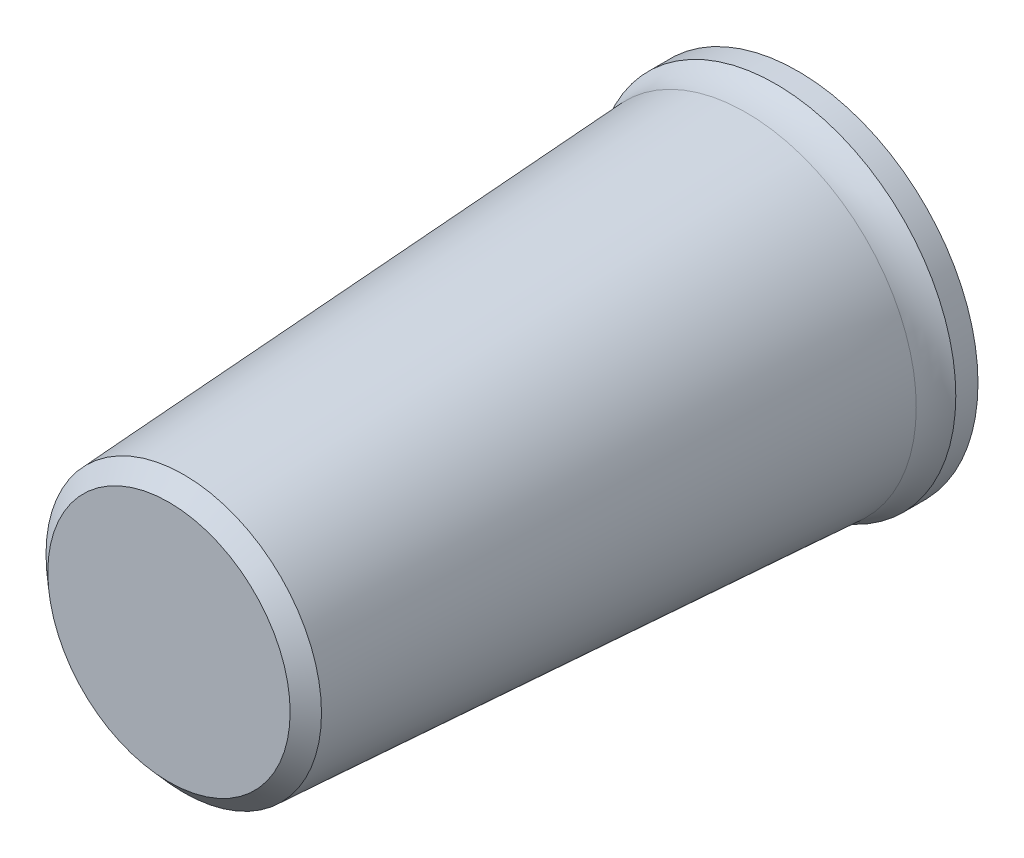
ISO-10303-21;
HEADER;
FILE_DESCRIPTION(('STEP AP214'),'2;1');
FILE_NAME('part.step','',(''),(''),'','','');
FILE_SCHEMA(('AUTOMOTIVE_DESIGN { 1 0 10303 214 1 1 1 1 }'));
ENDSEC;
DATA;
#1=APPLICATION_CONTEXT('core data for automotive mechanical design processes');
#2=APPLICATION_PROTOCOL_DEFINITION('international standard','automotive_design',2000,#1);
#3=PRODUCT_CONTEXT('',#1,'mechanical');
#4=PRODUCT('Part','Part','',(#3));
#5=PRODUCT_RELATED_PRODUCT_CATEGORY('part','',(#4));
#6=PRODUCT_DEFINITION_FORMATION('','',#4);
#7=PRODUCT_DEFINITION_CONTEXT('part definition',#1,'design');
#8=PRODUCT_DEFINITION('design','',#6,#7);
#9=PRODUCT_DEFINITION_SHAPE('','',#8);
#10=(LENGTH_UNIT() NAMED_UNIT(*) SI_UNIT(.MILLI.,.METRE.));
#11=(NAMED_UNIT(*) PLANE_ANGLE_UNIT() SI_UNIT($,.RADIAN.));
#12=(NAMED_UNIT(*) SI_UNIT($,.STERADIAN.) SOLID_ANGLE_UNIT());
#13=UNCERTAINTY_MEASURE_WITH_UNIT(LENGTH_MEASURE(1.E-05),#10,'distance_accuracy_value','');
#14=(GEOMETRIC_REPRESENTATION_CONTEXT(3) GLOBAL_UNCERTAINTY_ASSIGNED_CONTEXT((#13)) GLOBAL_UNIT_ASSIGNED_CONTEXT((#10,
#11,#12)) REPRESENTATION_CONTEXT('',''));
#15=CARTESIAN_POINT('',(0.,0.,0.));
#16=DIRECTION('',(0.,0.,1.));
#17=DIRECTION('',(1.,0.,0.));
#18=AXIS2_PLACEMENT_3D('',#15,#16,#17);
#19=CARTESIAN_POINT('',(0.,0.,0.746051221567654));
#20=DIRECTION('',(0.,0.,1.));
#21=DIRECTION('',(1.,0.,0.));
#22=AXIS2_PLACEMENT_3D('',#19,#20,#21);
#23=TOROIDAL_SURFACE('',#22,3.09867345329122,0.8);
#24=CARTESIAN_POINT('',(0.,0.,0.699999999999999));
#25=DIRECTION('',(0.,0.,1.));
#26=DIRECTION('',(1.,0.,0.));
#27=AXIS2_PLACEMENT_3D('',#24,#25,#26);
#28=CIRCLE('',#27,2.3);
#29=CARTESIAN_POINT('',(2.3,0.,0.699999999999999));
#30=VERTEX_POINT('',#29);
#31=EDGE_CURVE('E59',#30,#30,#28,.T.);
#32=ORIENTED_EDGE('',*,*,#31,.F.);
#33=EDGE_LOOP('',(#32));
#34=FACE_BOUND('',#33,.T.);
#35=CARTESIAN_POINT('',(0.,0.,0.3));
#36=DIRECTION('',(0.,0.,1.));
#37=DIRECTION('',(1.,0.,0.));
#38=AXIS2_PLACEMENT_3D('',#35,#36,#37);
#39=CIRCLE('',#38,2.43456630249551);
#40=CARTESIAN_POINT('',(2.43456630249551,0.,0.3));
#41=VERTEX_POINT('',#40);
#42=EDGE_CURVE('E70',#41,#41,#39,.T.);
#43=ORIENTED_EDGE('',*,*,#42,.T.);
#44=EDGE_LOOP('',(#43));
#45=FACE_BOUND('',#44,.T.);
#46=ADVANCED_FACE('F45',(#34,#45),#23,.F.);
#47=CARTESIAN_POINT('',(0.,0.,0.699999999999999));
#48=DIRECTION('',(0.,0.,-1.));
#49=DIRECTION('',(-1.,0.,0.));
#50=AXIS2_PLACEMENT_3D('',#47,#48,#49);
#51=CONICAL_SURFACE('',#50,2.3,0.0575958653158128);
#52=CARTESIAN_POINT('',(0.,0.,8.3003316366772));
#53=DIRECTION('',(0.,0.,1.));
#54=DIRECTION('',(1.,0.,0.));
#55=AXIS2_PLACEMENT_3D('',#52,#53,#54);
#56=CIRCLE('',#55,1.86176763513805);
#57=CARTESIAN_POINT('',(1.86176763513805,0.,8.3003316366772));
#58=VERTEX_POINT('',#57);
#59=EDGE_CURVE('E10',#58,#58,#56,.F.);
#60=ORIENTED_EDGE('',*,*,#59,.T.);
#61=EDGE_LOOP('',(#60));
#62=FACE_BOUND('',#61,.T.);
#63=ORIENTED_EDGE('',*,*,#31,.T.);
#64=EDGE_LOOP('',(#63));
#65=FACE_BOUND('',#64,.T.);
#66=ADVANCED_FACE('F90',(#62,#65),#51,.T.);
#67=CARTESIAN_POINT('',(0.,0.,8.5));
#68=DIRECTION('',(0.,0.,-1.));
#69=DIRECTION('',(-1.,0.,0.));
#70=AXIS2_PLACEMENT_3D('',#67,#68,#69);
#71=PLANE('',#70);
#72=CARTESIAN_POINT('',(0.,0.,8.5));
#73=DIRECTION('',(0.,0.,-1.));
#74=DIRECTION('',(-1.,0.,0.));
#75=AXIS2_PLACEMENT_3D('',#72,#73,#74);
#76=CIRCLE('',#75,1.63766477692032);
#77=CARTESIAN_POINT('',(-1.63766477692032,0.,8.5));
#78=VERTEX_POINT('',#77);
#79=EDGE_CURVE('E54',#78,#78,#76,.F.);
#80=ORIENTED_EDGE('',*,*,#79,.T.);
#81=EDGE_LOOP('',(#80));
#82=FACE_BOUND('',#81,.T.);
#83=ADVANCED_FACE('F84',(#82),#71,.F.);
#84=CARTESIAN_POINT('',(0.,2.43456630249551,0.));
#85=DIRECTION('',(0.,0.,1.));
#86=DIRECTION('',(1.,0.,0.));
#87=AXIS2_PLACEMENT_3D('',#84,#85,#86);
#88=PLANE('',#87);
#89=CARTESIAN_POINT('',(0.,0.,0.));
#90=DIRECTION('',(0.,0.,1.));
#91=DIRECTION('',(1.,0.,0.));
#92=AXIS2_PLACEMENT_3D('',#89,#90,#91);
#93=CIRCLE('',#92,2.43456630249551);
#94=CARTESIAN_POINT('',(2.43456630249551,0.,0.));
#95=VERTEX_POINT('',#94);
#96=EDGE_CURVE('E64',#95,#95,#93,.T.);
#97=ORIENTED_EDGE('',*,*,#96,.F.);
#98=EDGE_LOOP('',(#97));
#99=FACE_BOUND('',#98,.T.);
#100=ADVANCED_FACE('F79',(#99),#88,.F.);
#101=CARTESIAN_POINT('',(0.,0.,14.0337308707124));
#102=DIRECTION('',(0.,0.,1.));
#103=DIRECTION('',(1.,0.,0.));
#104=AXIS2_PLACEMENT_3D('',#101,#102,#103);
#105=CYLINDRICAL_SURFACE('',#104,2.43456630249551);
#106=ORIENTED_EDGE('',*,*,#42,.F.);
#107=EDGE_LOOP('',(#106));
#108=FACE_BOUND('',#107,.T.);
#109=ORIENTED_EDGE('',*,*,#96,.T.);
#110=EDGE_LOOP('',(#109));
#111=FACE_BOUND('',#110,.T.);
#112=ADVANCED_FACE('F76',(#108,#111),#105,.T.);
#113=CARTESIAN_POINT('',(0.,0.,8.5));
#114=DIRECTION('',(0.,0.,-1.));
#115=DIRECTION('',(-1.,0.,0.));
#116=AXIS2_PLACEMENT_3D('',#113,#114,#115);
#117=CONICAL_SURFACE('',#116,1.63766477692032,0.84299402871326);
#118=ORIENTED_EDGE('',*,*,#59,.F.);
#119=EDGE_LOOP('',(#118));
#120=FACE_BOUND('',#119,.T.);
#121=ORIENTED_EDGE('',*,*,#79,.F.);
#122=EDGE_LOOP('',(#121));
#123=FACE_BOUND('',#122,.T.);
#124=ADVANCED_FACE('F48',(#120,#123),#117,.T.);
#125=CLOSED_SHELL('',(#46,#66,#83,#100,#112,#124));
#126=MANIFOLD_SOLID_BREP('B2',#125);
#127=ADVANCED_BREP_SHAPE_REPRESENTATION('',(#18,#126),#14);
#128=SHAPE_DEFINITION_REPRESENTATION(#9,#127);
ENDSEC;
END-ISO-10303-21;
